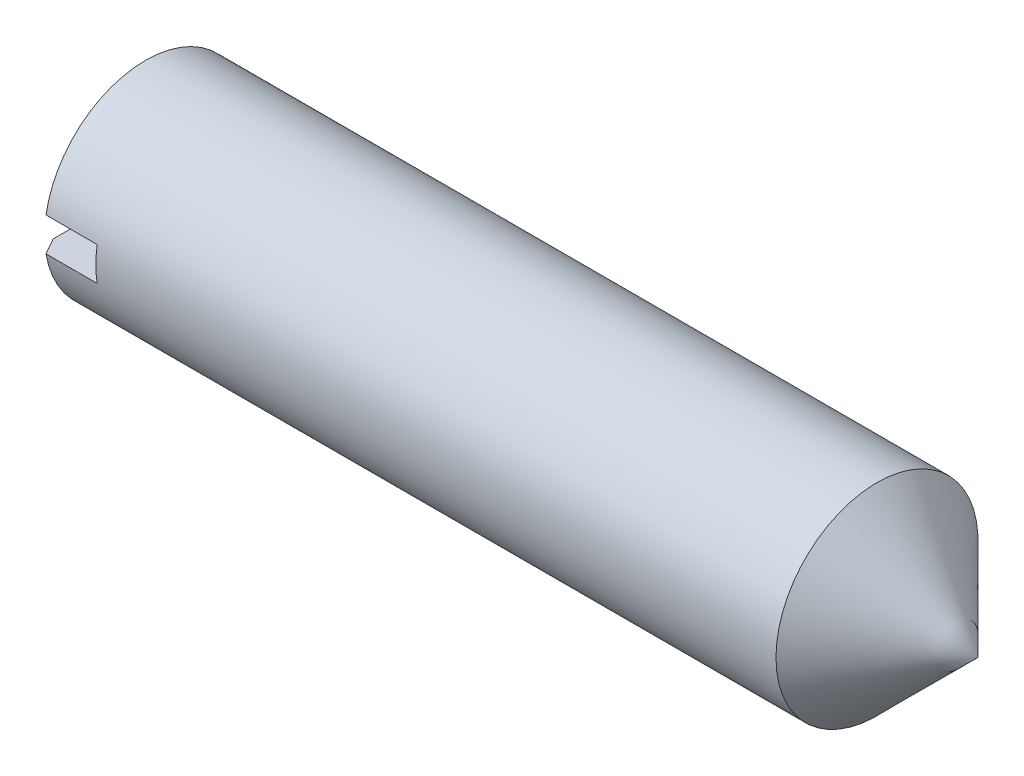
ISO-10303-21;
HEADER;
FILE_DESCRIPTION(('STEP AP214'),'2;1');
FILE_NAME('part.step','',(''),(''),'','','');
FILE_SCHEMA(('AUTOMOTIVE_DESIGN { 1 0 10303 214 1 1 1 1 }'));
ENDSEC;
DATA;
#1=APPLICATION_CONTEXT('core data for automotive mechanical design processes');
#2=APPLICATION_PROTOCOL_DEFINITION('international standard','automotive_design',2000,#1);
#3=PRODUCT_CONTEXT('',#1,'mechanical');
#4=PRODUCT('Part','Part','',(#3));
#5=PRODUCT_RELATED_PRODUCT_CATEGORY('part','',(#4));
#6=PRODUCT_DEFINITION_FORMATION('','',#4);
#7=PRODUCT_DEFINITION_CONTEXT('part definition',#1,'design');
#8=PRODUCT_DEFINITION('design','',#6,#7);
#9=PRODUCT_DEFINITION_SHAPE('','',#8);
#10=(LENGTH_UNIT() NAMED_UNIT(*) SI_UNIT(.MILLI.,.METRE.));
#11=(NAMED_UNIT(*) PLANE_ANGLE_UNIT() SI_UNIT($,.RADIAN.));
#12=(NAMED_UNIT(*) SI_UNIT($,.STERADIAN.) SOLID_ANGLE_UNIT());
#13=UNCERTAINTY_MEASURE_WITH_UNIT(LENGTH_MEASURE(1.E-05),#10,'distance_accuracy_value','');
#14=(GEOMETRIC_REPRESENTATION_CONTEXT(3) GLOBAL_UNCERTAINTY_ASSIGNED_CONTEXT((#13)) GLOBAL_UNIT_ASSIGNED_CONTEXT((#10,
#11,#12)) REPRESENTATION_CONTEXT('',''));
#15=CARTESIAN_POINT('',(0.,0.,0.));
#16=DIRECTION('',(0.,0.,1.));
#17=DIRECTION('',(1.,0.,0.));
#18=AXIS2_PLACEMENT_3D('',#15,#16,#17);
#19=CARTESIAN_POINT('',(0.,0.,0.));
#20=DIRECTION('',(-1.,0.,0.));
#21=DIRECTION('',(0.,0.,1.));
#22=AXIS2_PLACEMENT_3D('',#19,#20,#21);
#23=PLANE('',#22);
#24=CARTESIAN_POINT('',(0.,0.,0.));
#25=DIRECTION('',(-1.,0.,0.));
#26=DIRECTION('',(0.,0.,1.));
#27=AXIS2_PLACEMENT_3D('',#24,#25,#26);
#28=CIRCLE('',#27,5.036);
#29=CARTESIAN_POINT('',(0.,-1.,-4.93571636138058));
#30=VERTEX_POINT('',#29);
#31=CARTESIAN_POINT('',(0.,-0.999999999999999,4.93571636138058));
#32=VERTEX_POINT('',#31);
#33=EDGE_CURVE('E158',#30,#32,#28,.T.);
#34=ORIENTED_EDGE('',*,*,#33,.T.);
#35=DIRECTION('',(0.,0.,-1.));
#36=VECTOR('',#35,1.);
#37=CARTESIAN_POINT('',(0.,-0.999999999999999,6.));
#38=LINE('',#37,#36);
#39=EDGE_CURVE('E114',#32,#30,#38,.T.);
#40=ORIENTED_EDGE('',*,*,#39,.T.);
#41=EDGE_LOOP('',(#34,#40));
#42=FACE_BOUND('',#41,.T.);
#43=ADVANCED_FACE('F35',(#42),#23,.T.);
#44=CARTESIAN_POINT('',(0.,0.,0.));
#45=DIRECTION('',(1.,0.,0.));
#46=DIRECTION('',(0.,0.,-1.));
#47=AXIS2_PLACEMENT_3D('',#44,#45,#46);
#48=CONICAL_SURFACE('',#47,5.036,1.04719755119663);
#49=CARTESIAN_POINT('',(0.556565659498765,0.,0.));
#50=DIRECTION('',(-1.,0.,0.));
#51=DIRECTION('',(0.,0.,1.));
#52=AXIS2_PLACEMENT_3D('',#49,#50,#51);
#53=CIRCLE('',#52,6.);
#54=CARTESIAN_POINT('',(0.556565659498765,-1.,-5.91607978309962));
#55=VERTEX_POINT('',#54);
#56=CARTESIAN_POINT('',(0.556565659498765,-0.999999999999999,5.91607978309962));
#57=VERTEX_POINT('',#56);
#58=EDGE_CURVE('E163',#55,#57,#53,.T.);
#59=ORIENTED_EDGE('',*,*,#58,.T.);
#60=CARTESIAN_POINT('',(4.73989669271483,-0.999999999999998,13.2079399731122));
#61=CARTESIAN_POINT('',(4.41853771720244,-0.999999999999998,12.649708210717));
#62=CARTESIAN_POINT('',(4.09724308620707,-0.999999999999999,12.0914392943507));
#63=CARTESIAN_POINT('',(3.4549186683915,-0.999999999999999,10.9747439104665));
#64=CARTESIAN_POINT('',(3.13388888345024,-0.999999999999999,10.4163174418678));
#65=CARTESIAN_POINT('',(2.49197762047842,-0.999999999999999,9.29878375972739));
#66=CARTESIAN_POINT('',(2.17109646770033,-0.999999999999999,8.73967635935292));
#67=CARTESIAN_POINT('',(1.5300275923409,-0.999999999999999,7.62106803973439));
#68=CARTESIAN_POINT('',(1.20983986573005,-0.999999999999999,7.06156712280223));
#69=CARTESIAN_POINT('',(0.731752999683646,-0.999999999999999,6.22374471344308));
#70=CARTESIAN_POINT('',(0.573331144759489,-0.999999999999999,5.94572157695904));
#71=CARTESIAN_POINT('',(0.257006805730443,-0.999999999999999,5.38937510077954));
#72=CARTESIAN_POINT('',(0.0991043281518022,-0.999999999999999,5.11105175736974));
#73=CARTESIAN_POINT('',(-0.215803871687391,-0.999999999999999,4.55405780901709));
#74=CARTESIAN_POINT('',(-0.372809954009694,-0.999999999999999,4.27538740768412));
#75=CARTESIAN_POINT('',(-0.685421411461987,-0.999999999999999,3.71727146951171));
#76=CARTESIAN_POINT('',(-0.841026834596689,-1.,3.43782595967023));
#77=CARTESIAN_POINT('',(-1.07280047051857,-1.,3.01670739395931));
#78=CARTESIAN_POINT('',(-1.15000341162115,-1.,2.87560489491669));
#79=CARTESIAN_POINT('',(-1.30334590311718,-1.,2.59280771309016));
#80=CARTESIAN_POINT('',(-1.37948536629294,-1.,2.45111298296012));
#81=CARTESIAN_POINT('',(-1.53019389021686,-1.,2.16666998975977));
#82=CARTESIAN_POINT('',(-1.60476099220117,-0.999999999999999,2.02392068095096));
#83=CARTESIAN_POINT('',(-1.71445658720684,-1.,1.80870871103214));
#84=CARTESIAN_POINT('',(-1.75066016319061,-1.,1.73679509885007));
#85=CARTESIAN_POINT('',(-1.82208482318114,-1.,1.59248261773203));
#86=CARTESIAN_POINT('',(-1.85730593731415,-1.,1.52008376376016));
#87=CARTESIAN_POINT('',(-1.92735529771608,-1.,1.37261463948839));
#88=CARTESIAN_POINT('',(-1.96214530553783,-1.,1.29752611216615));
#89=CARTESIAN_POINT('',(-2.02965956084307,-1.,1.14642727351844));
#90=CARTESIAN_POINT('',(-2.06238404828155,-1.,1.07041707049315));
#91=CARTESIAN_POINT('',(-2.12476431844618,-1.,0.917145557122222));
#92=CARTESIAN_POINT('',(-2.15442052211011,-1.,0.839884420078598));
#93=CARTESIAN_POINT('',(-2.20906255805527,-1.,0.683706866903888));
#94=CARTESIAN_POINT('',(-2.23405029456052,-1.,0.604791140337526));
#95=CARTESIAN_POINT('',(-2.27018581045352,-1.,0.470093422561839));
#96=CARTESIAN_POINT('',(-2.28321589300996,-1.,0.414824677608005));
#97=CARTESIAN_POINT('',(-2.3049462303462,-1.,0.303453047162208));
#98=CARTESIAN_POINT('',(-2.31364920633167,-1.,0.247350708818641));
#99=CARTESIAN_POINT('',(-2.32581520982486,-1.,0.13495705990007));
#100=CARTESIAN_POINT('',(-2.32931440889467,-1.,0.0786698056186482));
#101=CARTESIAN_POINT('',(-2.33076867881164,-1.,-0.0339758725520376));
#102=CARTESIAN_POINT('',(-2.32872385654246,-1.,-0.090334295048305));
#103=CARTESIAN_POINT('',(-2.3180579912098,-1.,-0.217768647723007));
#104=CARTESIAN_POINT('',(-2.3078092184783,-1.,-0.288706275864568));
#105=CARTESIAN_POINT('',(-2.280414489516,-1.,-0.429255862703966));
#106=CARTESIAN_POINT('',(-2.2632604858775,-1.,-0.49886617505618));
#107=CARTESIAN_POINT('',(-2.2336732423078,-1.,-0.602653040473396));
#108=CARTESIAN_POINT('',(-2.22308279162327,-1.,-0.637377371820186));
#109=CARTESIAN_POINT('',(-2.20083833270244,-1.,-0.706460987270025));
#110=CARTESIAN_POINT('',(-2.18918499575322,-1.,-0.740820486688082));
#111=CARTESIAN_POINT('',(-2.16499431488904,-1.,-0.809218732225817));
#112=CARTESIAN_POINT('',(-2.15245710212568,-1.,-0.84325752508653));
#113=CARTESIAN_POINT('',(-2.1266433301133,-1.,-0.91105862463122));
#114=CARTESIAN_POINT('',(-2.11336665637896,-1.,-0.944820887568746));
#115=CARTESIAN_POINT('',(-2.06998388355674,-1.,-1.05227293315393));
#116=CARTESIAN_POINT('',(-2.03871498859511,-1.,-1.12549298780915));
#117=CARTESIAN_POINT('',(-1.97418773021559,-1.,-1.27105481935724));
#118=CARTESIAN_POINT('',(-1.94092900538411,-1.,-1.34339643381073));
#119=CARTESIAN_POINT('',(-1.87300145739127,-1.,-1.48745172367406));
#120=CARTESIAN_POINT('',(-1.83833201130238,-1.,-1.55916510431244));
#121=CARTESIAN_POINT('',(-1.76798292469884,-1.,-1.70209571429685));
#122=CARTESIAN_POINT('',(-1.73230324722167,-1.,-1.77331292536984));
#123=CARTESIAN_POINT('',(-1.62404833166045,-1.,-1.98662313537005));
#124=CARTESIAN_POINT('',(-1.55036430564616,-1.,-2.12815237228352));
#125=CARTESIAN_POINT('',(-1.40130813476099,-1.,-2.41025810099429));
#126=CARTESIAN_POINT('',(-1.32593649693932,-1.,-2.55083486286056));
#127=CARTESIAN_POINT('',(-1.17450983157065,-1.,-2.83063597104794));
#128=CARTESIAN_POINT('',(-1.09846071331473,-1.,-2.9698635188263));
#129=CARTESIAN_POINT('',(-0.945628453570271,-1.,-3.24792809661776));
#130=CARTESIAN_POINT('',(-0.868845256726566,-1.,-3.3867650961424));
#131=CARTESIAN_POINT('',(-0.637891315015069,-1.,-3.80258527592336));
#132=CARTESIAN_POINT('',(-0.482967580837516,-1.,-4.07914988721106));
#133=CARTESIAN_POINT('',(-0.119566497031354,-1.,-4.72494312842936));
#134=CARTESIAN_POINT('',(0.0893330443982409,-1.,-5.09393352806221));
#135=CARTESIAN_POINT('',(0.508131169896265,-1.,-5.83135176267693));
#136=CARTESIAN_POINT('',(0.718029765116063,-1.,-6.19977959131851));
#137=CARTESIAN_POINT('',(1.13850339248353,-1.,-6.93645171703563));
#138=CARTESIAN_POINT('',(1.34907866934877,-1.,-7.30469587435077));
#139=CARTESIAN_POINT('',(1.770602232516,-1.,-8.04096877388174));
#140=CARTESIAN_POINT('',(1.98155051744594,-1.,-8.40899751688335));
#141=CARTESIAN_POINT('',(2.40459995529787,-1.,-9.14648067015203));
#142=CARTESIAN_POINT('',(2.61670218630784,-1.,-9.51593446186714));
#143=CARTESIAN_POINT('',(3.04108596616447,-1.,-10.2547396320326));
#144=CARTESIAN_POINT('',(3.2533675152308,-1.,-10.6240910103568));
#145=CARTESIAN_POINT('',(3.67796813526833,-1.,-11.3625576054534));
#146=CARTESIAN_POINT('',(3.89028714937822,-1.,-11.7316728549228));
#147=CARTESIAN_POINT('',(4.31502474467967,-1.,-12.469845406271));
#148=CARTESIAN_POINT('',(4.52744332573721,-1.,-12.8389027082269));
#149=CARTESIAN_POINT('',(4.73989669271483,-1.,-13.2079399731122));
#150=B_SPLINE_CURVE_WITH_KNOTS('',3,(#60,#61,#62,#63,#64,#65,#66,#67,#68,#69,#70,#71,#72,#73,
#74,#75,#76,#77,#78,#79,#80,#81,#82,#83,#84,#85,#86,#87,#88,#89,#90,#91,#92,#93,#94,#95,#96,#97,
#98,#99,#100,#101,#102,#103,#104,#105,#106,#107,#108,#109,#110,#111,#112,#113,#114,#115,#116,
#117,#118,#119,#120,#121,#122,#123,#124,#125,#126,#127,#128,#129,#130,#131,#132,#133,#134,#135,
#136,#137,#138,#139,#140,#141,#142,#143,#144,#145,#146,#147,#148,#149),.UNSPECIFIED.,.F.,.F.,(4,
2,2,2,2,2,2,2,2,2,2,2,2,2,2,2,2,2,2,2,2,2,2,2,2,2,2,2,2,2,2,2,2,2,2,2,2,2,2,2,2,2,2,2,4),(0.,
1.93236881448588,3.86475122217014,5.79868288382638,7.73260327702296,8.69257649447117,
9.652561728751,10.6121295561864,11.5716643702227,12.0541876544273,12.5367502815661,
13.0198822422753,13.2614145867644,13.5029395167376,13.7511887400157,13.9994090704807,
14.247595302324,14.4956800792536,14.6658994442622,14.8360116268792,15.004935737355,
15.1738565911514,15.3884236657496,15.6032415257331,15.7121389898236,15.8209681475887,
15.9297811908746,16.0386111279733,16.2774120534189,16.5162564848272,16.7552075514785,
16.9941673722405,17.4728272005422,17.9513450939761,18.4272722369047,18.9032355559994,
19.8542316736469,21.1262890781179,22.3983607146574,23.6709606308467,24.9435558756872,
26.2215820771649,27.4996098466162,28.7770795475622,30.0545475337865),.UNSPECIFIED.);
#151=EDGE_CURVE('E105',#57,#32,#150,.T.);
#152=ORIENTED_EDGE('',*,*,#151,.T.);
#153=ORIENTED_EDGE('',*,*,#33,.F.);
#154=EDGE_CURVE('E168',#30,#55,#150,.T.);
#155=ORIENTED_EDGE('',*,*,#154,.T.);
#156=EDGE_LOOP('',(#59,#152,#153,#155));
#157=FACE_BOUND('',#156,.T.);
#158=ADVANCED_FACE('F143',(#157),#48,.T.);
#159=CARTESIAN_POINT('',(-12.7,0.,0.));
#160=DIRECTION('',(-1.,0.,0.));
#161=DIRECTION('',(0.,0.,1.));
#162=AXIS2_PLACEMENT_3D('',#159,#160,#161);
#163=CYLINDRICAL_SURFACE('',#162,6.);
#164=CARTESIAN_POINT('',(44.,0.,0.));
#165=DIRECTION('',(-1.,0.,0.));
#166=DIRECTION('',(0.,0.,1.));
#167=AXIS2_PLACEMENT_3D('',#164,#165,#166);
#168=CIRCLE('',#167,6.);
#169=CARTESIAN_POINT('',(44.,0.,6.));
#170=VERTEX_POINT('',#169);
#171=EDGE_CURVE('E167',#170,#170,#168,.T.);
#172=ORIENTED_EDGE('',*,*,#171,.T.);
#173=EDGE_LOOP('',(#172));
#174=FACE_BOUND('',#173,.T.);
#175=ORIENTED_EDGE('',*,*,#58,.F.);
#176=DIRECTION('',(-1.,0.,0.));
#177=VECTOR('',#176,1.);
#178=CARTESIAN_POINT('',(-12.7,-1.,-5.91607978309962));
#179=LINE('',#178,#177);
#180=CARTESIAN_POINT('',(3.6,-1.,-5.91607978309962));
#181=VERTEX_POINT('',#180);
#182=EDGE_CURVE('E12',#55,#181,#179,.F.);
#183=ORIENTED_EDGE('',*,*,#182,.T.);
#184=CARTESIAN_POINT('',(3.6,0.,0.));
#185=DIRECTION('',(-1.,0.,0.));
#186=DIRECTION('',(0.,0.,1.));
#187=AXIS2_PLACEMENT_3D('',#184,#185,#186);
#188=CIRCLE('',#187,6.);
#189=CARTESIAN_POINT('',(3.6,1.,-5.91607978309962));
#190=VERTEX_POINT('',#189);
#191=EDGE_CURVE('E101',#181,#190,#188,.F.);
#192=ORIENTED_EDGE('',*,*,#191,.T.);
#193=DIRECTION('',(-1.,0.,0.));
#194=VECTOR('',#193,1.);
#195=CARTESIAN_POINT('',(-12.7,1.,-5.91607978309962));
#196=LINE('',#195,#194);
#197=CARTESIAN_POINT('',(0.556565659498765,1.,-5.91607978309962));
#198=VERTEX_POINT('',#197);
#199=EDGE_CURVE('E43',#198,#190,#196,.F.);
#200=ORIENTED_EDGE('',*,*,#199,.F.);
#201=CARTESIAN_POINT('',(0.556565659498765,1.,5.91607978309962));
#202=VERTEX_POINT('',#201);
#203=EDGE_CURVE('E159',#202,#198,#53,.T.);
#204=ORIENTED_EDGE('',*,*,#203,.F.);
#205=DIRECTION('',(-1.,0.,0.));
#206=VECTOR('',#205,1.);
#207=CARTESIAN_POINT('',(-12.7,1.,5.91607978309962));
#208=LINE('',#207,#206);
#209=CARTESIAN_POINT('',(3.6,1.,5.91607978309962));
#210=VERTEX_POINT('',#209);
#211=EDGE_CURVE('E94',#210,#202,#208,.T.);
#212=ORIENTED_EDGE('',*,*,#211,.F.);
#213=CARTESIAN_POINT('',(3.6,-0.999999999999999,5.91607978309962));
#214=VERTEX_POINT('',#213);
#215=EDGE_CURVE('E87',#210,#214,#188,.F.);
#216=ORIENTED_EDGE('',*,*,#215,.T.);
#217=DIRECTION('',(-1.,0.,0.));
#218=VECTOR('',#217,1.);
#219=CARTESIAN_POINT('',(-12.7,-0.999999999999999,5.91607978309962));
#220=LINE('',#219,#218);
#221=EDGE_CURVE('E91',#214,#57,#220,.T.);
#222=ORIENTED_EDGE('',*,*,#221,.T.);
#223=EDGE_LOOP('',(#175,#183,#192,#200,#204,#212,#216,#222));
#224=FACE_BOUND('',#223,.T.);
#225=ADVANCED_FACE('F90',(#174,#224),#163,.T.);
#226=DIRECTION('',(0.,0.,-1.));
#227=VECTOR('',#226,1.);
#228=CARTESIAN_POINT('',(0.,1.,6.));
#229=LINE('',#228,#227);
#230=CARTESIAN_POINT('',(0.,1.,4.93571636138058));
#231=VERTEX_POINT('',#230);
#232=CARTESIAN_POINT('',(0.,1.,-4.93571636138058));
#233=VERTEX_POINT('',#232);
#234=EDGE_CURVE('E117',#231,#233,#229,.T.);
#235=ORIENTED_EDGE('',*,*,#234,.F.);
#236=EDGE_CURVE('E99',#231,#233,#28,.T.);
#237=ORIENTED_EDGE('',*,*,#236,.T.);
#238=EDGE_LOOP('',(#235,#237));
#239=FACE_BOUND('',#238,.T.);
#240=ADVANCED_FACE('F37',(#239),#23,.T.);
#241=CARTESIAN_POINT('',(4.73989669271483,1.,13.2079399731122));
#242=CARTESIAN_POINT('',(4.41853771720244,1.,12.649708210717));
#243=CARTESIAN_POINT('',(4.09724308620707,1.,12.0914392943507));
#244=CARTESIAN_POINT('',(3.4549186683915,1.,10.9747439104665));
#245=CARTESIAN_POINT('',(3.13388888345024,1.,10.4163174418678));
#246=CARTESIAN_POINT('',(2.49197762047842,1.,9.29878375972739));
#247=CARTESIAN_POINT('',(2.17109646770033,1.,8.73967635935292));
#248=CARTESIAN_POINT('',(1.5300275923409,1.,7.62106803973439));
#249=CARTESIAN_POINT('',(1.20983986573005,1.,7.06156712280223));
#250=CARTESIAN_POINT('',(0.731752999683645,1.,6.22374471344308));
#251=CARTESIAN_POINT('',(0.573331144759488,1.,5.94572157695904));
#252=CARTESIAN_POINT('',(0.257006805730442,1.,5.38937510077954));
#253=CARTESIAN_POINT('',(0.0991043281518012,1.,5.11105175736974));
#254=CARTESIAN_POINT('',(-0.215803871687393,1.,4.55405780901709));
#255=CARTESIAN_POINT('',(-0.372809954009695,1.,4.27538740768411));
#256=CARTESIAN_POINT('',(-0.685421411461988,1.,3.7172714695117));
#257=CARTESIAN_POINT('',(-0.841026834596691,1.,3.43782595967023));
#258=CARTESIAN_POINT('',(-1.07280047051857,1.,3.01670739395931));
#259=CARTESIAN_POINT('',(-1.15000341162115,1.,2.87560489491669));
#260=CARTESIAN_POINT('',(-1.30334590311718,1.,2.59280771309016));
#261=CARTESIAN_POINT('',(-1.37948536629294,1.,2.45111298296012));
#262=CARTESIAN_POINT('',(-1.53019389021686,1.,2.16666998975977));
#263=CARTESIAN_POINT('',(-1.60476099220117,1.,2.02392068095095));
#264=CARTESIAN_POINT('',(-1.71445658720685,1.,1.80870871103214));
#265=CARTESIAN_POINT('',(-1.75066016319061,1.,1.73679509885006));
#266=CARTESIAN_POINT('',(-1.82208482318115,1.,1.59248261773203));
#267=CARTESIAN_POINT('',(-1.85730593731415,1.,1.52008376376016));
#268=CARTESIAN_POINT('',(-1.92735529771608,1.,1.37261463948839));
#269=CARTESIAN_POINT('',(-1.96214530553783,1.,1.29752611216615));
#270=CARTESIAN_POINT('',(-2.02965956084307,1.,1.14642727351844));
#271=CARTESIAN_POINT('',(-2.06238404828155,1.,1.07041707049315));
#272=CARTESIAN_POINT('',(-2.12476431844618,1.,0.917145557122221));
#273=CARTESIAN_POINT('',(-2.15442052211011,1.,0.839884420078597));
#274=CARTESIAN_POINT('',(-2.20906255805527,1.,0.683706866903886));
#275=CARTESIAN_POINT('',(-2.23405029456052,1.,0.604791140337524));
#276=CARTESIAN_POINT('',(-2.27018581045352,1.,0.470093422561838));
#277=CARTESIAN_POINT('',(-2.28321589300996,1.,0.414824677608004));
#278=CARTESIAN_POINT('',(-2.3049462303462,1.,0.303453047162207));
#279=CARTESIAN_POINT('',(-2.31364920633167,1.,0.24735070881864));
#280=CARTESIAN_POINT('',(-2.32581520982486,1.,0.134957059900069));
#281=CARTESIAN_POINT('',(-2.32931440889467,1.,0.0786698056186469));
#282=CARTESIAN_POINT('',(-2.33076867881164,1.,-0.0339758725520388));
#283=CARTESIAN_POINT('',(-2.32872385654246,1.,-0.0903342950483062));
#284=CARTESIAN_POINT('',(-2.3180579912098,1.,-0.217768647723008));
#285=CARTESIAN_POINT('',(-2.3078092184783,1.,-0.288706275864569));
#286=CARTESIAN_POINT('',(-2.280414489516,1.,-0.429255862703967));
#287=CARTESIAN_POINT('',(-2.2632604858775,1.,-0.498866175056181));
#288=CARTESIAN_POINT('',(-2.2336732423078,1.,-0.602653040473397));
#289=CARTESIAN_POINT('',(-2.22308279162327,1.,-0.637377371820187));
#290=CARTESIAN_POINT('',(-2.20083833270244,1.,-0.706460987270026));
#291=CARTESIAN_POINT('',(-2.18918499575322,1.,-0.740820486688084));
#292=CARTESIAN_POINT('',(-2.16499431488904,1.,-0.809218732225819));
#293=CARTESIAN_POINT('',(-2.15245710212568,1.,-0.843257525086532));
#294=CARTESIAN_POINT('',(-2.1266433301133,1.,-0.911058624631222));
#295=CARTESIAN_POINT('',(-2.11336665637896,1.,-0.944820887568748));
#296=CARTESIAN_POINT('',(-2.06998388355674,1.,-1.05227293315393));
#297=CARTESIAN_POINT('',(-2.03871498859511,1.,-1.12549298780916));
#298=CARTESIAN_POINT('',(-1.97418773021559,1.,-1.27105481935724));
#299=CARTESIAN_POINT('',(-1.94092900538411,1.,-1.34339643381073));
#300=CARTESIAN_POINT('',(-1.87300145739127,1.,-1.48745172367406));
#301=CARTESIAN_POINT('',(-1.83833201130238,1.,-1.55916510431244));
#302=CARTESIAN_POINT('',(-1.76798292469884,1.,-1.70209571429685));
#303=CARTESIAN_POINT('',(-1.73230324722167,1.,-1.77331292536984));
#304=CARTESIAN_POINT('',(-1.62404833166045,1.,-1.98662313537006));
#305=CARTESIAN_POINT('',(-1.55036430564615,1.,-2.12815237228353));
#306=CARTESIAN_POINT('',(-1.40130813476098,1.,-2.4102581009943));
#307=CARTESIAN_POINT('',(-1.32593649693932,1.,-2.55083486286057));
#308=CARTESIAN_POINT('',(-1.17450983157065,1.,-2.83063597104795));
#309=CARTESIAN_POINT('',(-1.09846071331473,1.,-2.9698635188263));
#310=CARTESIAN_POINT('',(-0.945628453570267,1.,-3.24792809661776));
#311=CARTESIAN_POINT('',(-0.868845256726562,1.,-3.38676509614241));
#312=CARTESIAN_POINT('',(-0.637891315015066,1.,-3.80258527592337));
#313=CARTESIAN_POINT('',(-0.482967580837512,1.,-4.07914988721106));
#314=CARTESIAN_POINT('',(-0.11956649703135,1.,-4.72494312842937));
#315=CARTESIAN_POINT('',(0.0893330443982452,1.,-5.09393352806222));
#316=CARTESIAN_POINT('',(0.508131169896269,1.,-5.83135176267694));
#317=CARTESIAN_POINT('',(0.718029765116066,1.,-6.19977959131852));
#318=CARTESIAN_POINT('',(1.13850339248353,1.,-6.93645171703564));
#319=CARTESIAN_POINT('',(1.34907866934877,0.999999999999999,-7.30469587435077));
#320=CARTESIAN_POINT('',(1.770602232516,0.999999999999999,-8.04096877388175));
#321=CARTESIAN_POINT('',(1.98155051744595,0.999999999999999,-8.40899751688335));
#322=CARTESIAN_POINT('',(2.40459995529787,0.999999999999999,-9.14648067015204));
#323=CARTESIAN_POINT('',(2.61670218630784,0.999999999999999,-9.51593446186714));
#324=CARTESIAN_POINT('',(3.04108596616447,0.999999999999999,-10.2547396320326));
#325=CARTESIAN_POINT('',(3.25336751523081,0.999999999999999,-10.6240910103568));
#326=CARTESIAN_POINT('',(3.67796813526834,0.999999999999999,-11.3625576054534));
#327=CARTESIAN_POINT('',(3.89028714937822,0.999999999999999,-11.7316728549228));
#328=CARTESIAN_POINT('',(4.31502474467967,0.999999999999999,-12.469845406271));
#329=CARTESIAN_POINT('',(4.52744332573721,0.999999999999999,-12.8389027082269));
#330=CARTESIAN_POINT('',(4.73989669271483,0.999999999999999,-13.2079399731122));
#331=B_SPLINE_CURVE_WITH_KNOTS('',3,(#241,#242,#243,#244,#245,#246,#247,#248,#249,#250,#251,
#252,#253,#254,#255,#256,#257,#258,#259,#260,#261,#262,#263,#264,#265,#266,#267,#268,#269,#270,
#271,#272,#273,#274,#275,#276,#277,#278,#279,#280,#281,#282,#283,#284,#285,#286,#287,#288,#289,
#290,#291,#292,#293,#294,#295,#296,#297,#298,#299,#300,#301,#302,#303,#304,#305,#306,#307,#308,
#309,#310,#311,#312,#313,#314,#315,#316,#317,#318,#319,#320,#321,#322,#323,#324,#325,#326,#327,
#328,#329,#330),.UNSPECIFIED.,.F.,.F.,(4,2,2,2,2,2,2,2,2,2,2,2,2,2,2,2,2,2,2,2,2,2,2,2,2,2,2,2,
2,2,2,2,2,2,2,2,2,2,2,2,2,2,2,2,4),(0.,1.93236881448588,3.86475122217014,5.79868288382638,
7.73260327702296,8.69257649447118,9.65256172875101,10.6121295561864,11.5716643702227,
12.0541876544273,12.5367502815661,13.0198822422753,13.2614145867644,13.5029395167376,
13.7511887400157,13.9994090704807,14.247595302324,14.4956800792536,14.6658994442622,
14.8360116268792,15.004935737355,15.1738565911514,15.3884236657496,15.6032415257331,
15.7121389898236,15.8209681475887,15.9297811908746,16.0386111279733,16.2774120534189,
16.5162564848272,16.7552075514785,16.9941673722405,17.4728272005422,17.9513450939761,
18.4272722369047,18.9032355559994,19.854231673647,21.1262890781179,22.3983607146574,
23.6709606308467,24.9435558756872,26.2215820771649,27.4996098466162,28.7770795475622,
30.0545475337865),.UNSPECIFIED.);
#332=EDGE_CURVE('E109',#202,#231,#331,.T.);
#333=ORIENTED_EDGE('',*,*,#332,.F.);
#334=ORIENTED_EDGE('',*,*,#203,.T.);
#335=EDGE_CURVE('E112',#233,#198,#331,.T.);
#336=ORIENTED_EDGE('',*,*,#335,.F.);
#337=ORIENTED_EDGE('',*,*,#236,.F.);
#338=EDGE_LOOP('',(#333,#334,#336,#337));
#339=FACE_BOUND('',#338,.T.);
#340=ADVANCED_FACE('F130',(#339),#48,.T.);
#341=CARTESIAN_POINT('',(44.,0.,0.));
#342=DIRECTION('',(-1.,0.,0.));
#343=DIRECTION('',(0.,0.,1.));
#344=AXIS2_PLACEMENT_3D('',#341,#342,#343);
#345=CONICAL_SURFACE('',#344,6.,0.785398163397453);
#346=CARTESIAN_POINT('',(50.,0.,0.));
#347=VERTEX_POINT('',#346);
#348=VERTEX_LOOP('',#347);
#349=FACE_BOUND('',#348,.T.);
#350=ORIENTED_EDGE('',*,*,#171,.F.);
#351=EDGE_LOOP('',(#350));
#352=FACE_BOUND('',#351,.T.);
#353=ADVANCED_FACE('F140',(#349,#352),#345,.T.);
#354=CARTESIAN_POINT('',(3.6,-0.999999999999999,6.));
#355=DIRECTION('',(0.,1.,0.));
#356=DIRECTION('',(0.,0.,1.));
#357=AXIS2_PLACEMENT_3D('',#354,#355,#356);
#358=PLANE('',#357);
#359=ORIENTED_EDGE('',*,*,#39,.F.);
#360=ORIENTED_EDGE('',*,*,#151,.F.);
#361=ORIENTED_EDGE('',*,*,#221,.F.);
#362=DIRECTION('',(0.,0.,-1.));
#363=VECTOR('',#362,1.);
#364=CARTESIAN_POINT('',(3.6,-0.999999999999999,6.));
#365=LINE('',#364,#363);
#366=EDGE_CURVE('E103',#214,#181,#365,.T.);
#367=ORIENTED_EDGE('',*,*,#366,.T.);
#368=ORIENTED_EDGE('',*,*,#182,.F.);
#369=ORIENTED_EDGE('',*,*,#154,.F.);
#370=EDGE_LOOP('',(#359,#360,#361,#367,#368,#369));
#371=FACE_BOUND('',#370,.T.);
#372=ADVANCED_FACE('F102',(#371),#358,.T.);
#373=CARTESIAN_POINT('',(3.6,1.,6.));
#374=DIRECTION('',(0.,1.,0.));
#375=DIRECTION('',(0.,0.,1.));
#376=AXIS2_PLACEMENT_3D('',#373,#374,#375);
#377=PLANE('',#376);
#378=ORIENTED_EDGE('',*,*,#335,.T.);
#379=ORIENTED_EDGE('',*,*,#199,.T.);
#380=DIRECTION('',(0.,0.,-1.));
#381=VECTOR('',#380,1.);
#382=CARTESIAN_POINT('',(3.6,1.,6.));
#383=LINE('',#382,#381);
#384=EDGE_CURVE('E110',#210,#190,#383,.T.);
#385=ORIENTED_EDGE('',*,*,#384,.F.);
#386=ORIENTED_EDGE('',*,*,#211,.T.);
#387=ORIENTED_EDGE('',*,*,#332,.T.);
#388=ORIENTED_EDGE('',*,*,#234,.T.);
#389=EDGE_LOOP('',(#378,#379,#385,#386,#387,#388));
#390=FACE_BOUND('',#389,.T.);
#391=ADVANCED_FACE('F133',(#390),#377,.F.);
#392=CARTESIAN_POINT('',(3.6,1.,6.));
#393=DIRECTION('',(-1.,0.,0.));
#394=DIRECTION('',(0.,0.,1.));
#395=AXIS2_PLACEMENT_3D('',#392,#393,#394);
#396=PLANE('',#395);
#397=ORIENTED_EDGE('',*,*,#366,.F.);
#398=ORIENTED_EDGE('',*,*,#215,.F.);
#399=ORIENTED_EDGE('',*,*,#384,.T.);
#400=ORIENTED_EDGE('',*,*,#191,.F.);
#401=EDGE_LOOP('',(#397,#398,#399,#400));
#402=FACE_BOUND('',#401,.T.);
#403=ADVANCED_FACE('F107',(#402),#396,.T.);
#404=CLOSED_SHELL('',(#43,#158,#225,#240,#340,#353,#372,#391,#403));
#405=MANIFOLD_SOLID_BREP('B2',#404);
#406=ADVANCED_BREP_SHAPE_REPRESENTATION('',(#18,#405),#14);
#407=SHAPE_DEFINITION_REPRESENTATION(#9,#406);
ENDSEC;
END-ISO-10303-21;
